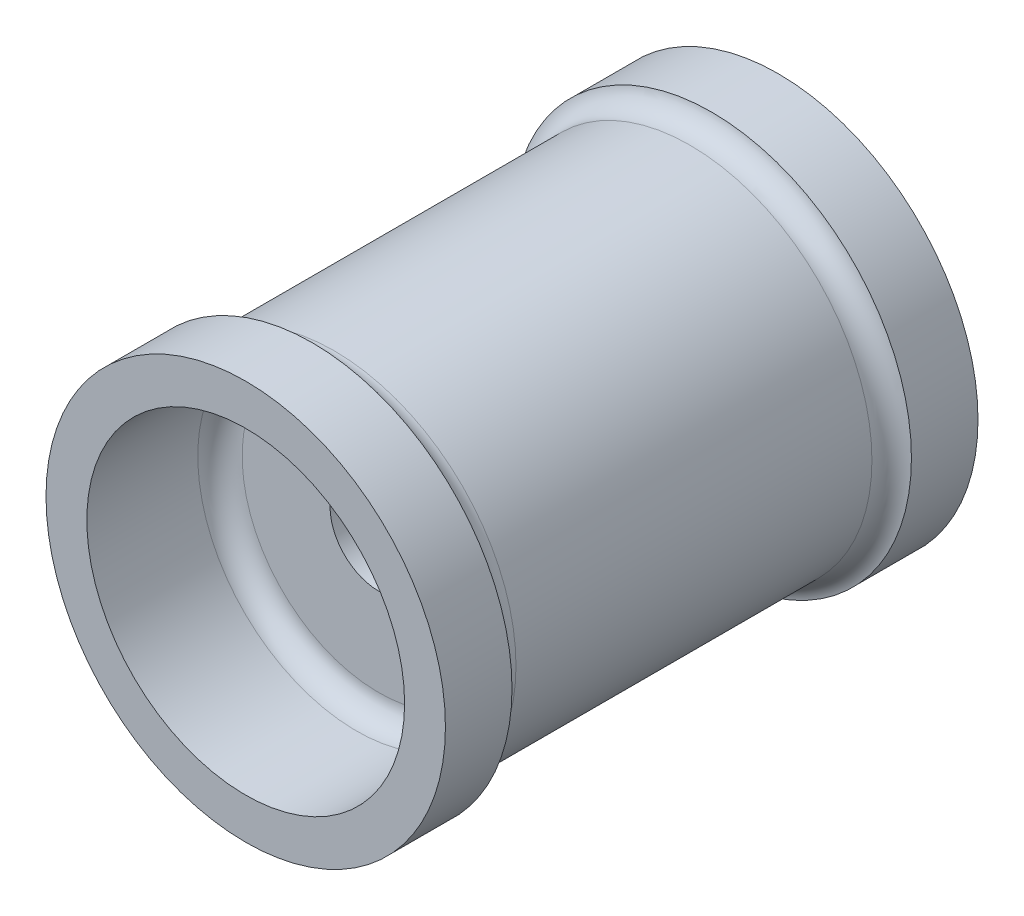
ISO-10303-21;
HEADER;
FILE_DESCRIPTION(('STEP AP214'),'2;1');
FILE_NAME('part.step','',(''),(''),'','','');
FILE_SCHEMA(('AUTOMOTIVE_DESIGN { 1 0 10303 214 1 1 1 1 }'));
ENDSEC;
DATA;
#1=APPLICATION_CONTEXT('core data for automotive mechanical design processes');
#2=APPLICATION_PROTOCOL_DEFINITION('international standard','automotive_design',2000,#1);
#3=PRODUCT_CONTEXT('',#1,'mechanical');
#4=PRODUCT('Part','Part','',(#3));
#5=PRODUCT_RELATED_PRODUCT_CATEGORY('part','',(#4));
#6=PRODUCT_DEFINITION_FORMATION('','',#4);
#7=PRODUCT_DEFINITION_CONTEXT('part definition',#1,'design');
#8=PRODUCT_DEFINITION('design','',#6,#7);
#9=PRODUCT_DEFINITION_SHAPE('','',#8);
#10=(LENGTH_UNIT() NAMED_UNIT(*) SI_UNIT(.MILLI.,.METRE.));
#11=(NAMED_UNIT(*) PLANE_ANGLE_UNIT() SI_UNIT($,.RADIAN.));
#12=(NAMED_UNIT(*) SI_UNIT($,.STERADIAN.) SOLID_ANGLE_UNIT());
#13=UNCERTAINTY_MEASURE_WITH_UNIT(LENGTH_MEASURE(1.E-05),#10,'distance_accuracy_value','');
#14=(GEOMETRIC_REPRESENTATION_CONTEXT(3) GLOBAL_UNCERTAINTY_ASSIGNED_CONTEXT((#13)) GLOBAL_UNIT_ASSIGNED_CONTEXT((#10,
#11,#12)) REPRESENTATION_CONTEXT('',''));
#15=CARTESIAN_POINT('',(0.,0.,0.));
#16=DIRECTION('',(0.,0.,1.));
#17=DIRECTION('',(1.,0.,0.));
#18=AXIS2_PLACEMENT_3D('',#15,#16,#17);
#19=CARTESIAN_POINT('',(0.,0.,16.));
#20=DIRECTION('',(0.,0.,1.));
#21=DIRECTION('',(1.,0.,0.));
#22=AXIS2_PLACEMENT_3D('',#19,#20,#21);
#23=TOROIDAL_SURFACE('',#22,6.16,1.);
#24=CARTESIAN_POINT('',(0.,0.,15.));
#25=DIRECTION('',(0.,0.,1.));
#26=DIRECTION('',(1.,0.,0.));
#27=AXIS2_PLACEMENT_3D('',#24,#25,#26);
#28=CIRCLE('',#27,6.16);
#29=CARTESIAN_POINT('',(6.16,0.,15.));
#30=VERTEX_POINT('',#29);
#31=EDGE_CURVE('E48',#30,#30,#28,.T.);
#32=ORIENTED_EDGE('',*,*,#31,.F.);
#33=EDGE_LOOP('',(#32));
#34=FACE_BOUND('',#33,.T.);
#35=CARTESIAN_POINT('',(0.,0.,16.));
#36=DIRECTION('',(0.,0.,1.));
#37=DIRECTION('',(1.,0.,0.));
#38=AXIS2_PLACEMENT_3D('',#35,#36,#37);
#39=CIRCLE('',#38,7.16);
#40=CARTESIAN_POINT('',(7.16,0.,16.));
#41=VERTEX_POINT('',#40);
#42=EDGE_CURVE('E10',#41,#41,#39,.F.);
#43=ORIENTED_EDGE('',*,*,#42,.F.);
#44=EDGE_LOOP('',(#43));
#45=FACE_BOUND('',#44,.T.);
#46=ADVANCED_FACE('F41',(#34,#45),#23,.F.);
#47=CARTESIAN_POINT('',(0.,0.,2.));
#48=DIRECTION('',(0.,0.,-1.));
#49=DIRECTION('',(-1.,0.,0.));
#50=AXIS2_PLACEMENT_3D('',#47,#48,#49);
#51=TOROIDAL_SURFACE('',#50,6.16,1.);
#52=CARTESIAN_POINT('',(0.,0.,3.));
#53=DIRECTION('',(0.,0.,-1.));
#54=DIRECTION('',(-1.,0.,0.));
#55=AXIS2_PLACEMENT_3D('',#52,#53,#54);
#56=CIRCLE('',#55,6.16);
#57=CARTESIAN_POINT('',(-6.16,0.,3.));
#58=VERTEX_POINT('',#57);
#59=EDGE_CURVE('E58',#58,#58,#56,.T.);
#60=ORIENTED_EDGE('',*,*,#59,.F.);
#61=EDGE_LOOP('',(#60));
#62=FACE_BOUND('',#61,.T.);
#63=CARTESIAN_POINT('',(0.,0.,2.));
#64=DIRECTION('',(0.,0.,-1.));
#65=DIRECTION('',(-1.,0.,0.));
#66=AXIS2_PLACEMENT_3D('',#63,#64,#65);
#67=CIRCLE('',#66,7.16);
#68=CARTESIAN_POINT('',(-7.16,0.,2.));
#69=VERTEX_POINT('',#68);
#70=EDGE_CURVE('E53',#69,#69,#67,.F.);
#71=ORIENTED_EDGE('',*,*,#70,.F.);
#72=EDGE_LOOP('',(#71));
#73=FACE_BOUND('',#72,.T.);
#74=ADVANCED_FACE('F122',(#62,#73),#51,.F.);
#75=CARTESIAN_POINT('',(0.,0.,18.));
#76=DIRECTION('',(0.,0.,-1.));
#77=DIRECTION('',(-1.,0.,0.));
#78=AXIS2_PLACEMENT_3D('',#75,#76,#77);
#79=CYLINDRICAL_SURFACE('',#78,2.2);
#80=CARTESIAN_POINT('',(0.,0.,3.));
#81=DIRECTION('',(0.,0.,-1.));
#82=DIRECTION('',(-1.,0.,0.));
#83=AXIS2_PLACEMENT_3D('',#80,#81,#82);
#84=CIRCLE('',#83,2.2);
#85=CARTESIAN_POINT('',(-2.2,0.,3.));
#86=VERTEX_POINT('',#85);
#87=EDGE_CURVE('E73',#86,#86,#84,.T.);
#88=ORIENTED_EDGE('',*,*,#87,.T.);
#89=EDGE_LOOP('',(#88));
#90=FACE_BOUND('',#89,.T.);
#91=CARTESIAN_POINT('',(0.,0.,15.));
#92=DIRECTION('',(0.,0.,1.));
#93=DIRECTION('',(1.,0.,0.));
#94=AXIS2_PLACEMENT_3D('',#91,#92,#93);
#95=CIRCLE('',#94,2.2);
#96=CARTESIAN_POINT('',(2.2,0.,15.));
#97=VERTEX_POINT('',#96);
#98=EDGE_CURVE('E100',#97,#97,#95,.T.);
#99=ORIENTED_EDGE('',*,*,#98,.T.);
#100=EDGE_LOOP('',(#99));
#101=FACE_BOUND('',#100,.T.);
#102=ADVANCED_FACE('F105',(#90,#101),#79,.F.);
#103=CARTESIAN_POINT('',(0.,0.,18.));
#104=DIRECTION('',(0.,0.,-1.));
#105=DIRECTION('',(-1.,0.,0.));
#106=AXIS2_PLACEMENT_3D('',#103,#104,#105);
#107=CYLINDRICAL_SURFACE('',#106,8.2);
#108=CARTESIAN_POINT('',(0.,0.,0.979795897113271));
#109=DIRECTION('',(0.,0.,-1.));
#110=DIRECTION('',(-1.,0.,0.));
#111=AXIS2_PLACEMENT_3D('',#108,#109,#110);
#112=CIRCLE('',#111,8.2);
#113=CARTESIAN_POINT('',(-8.2,0.,0.979795897113271));
#114=VERTEX_POINT('',#113);
#115=EDGE_CURVE('E64',#114,#114,#112,.F.);
#116=ORIENTED_EDGE('',*,*,#115,.T.);
#117=EDGE_LOOP('',(#116));
#118=FACE_BOUND('',#117,.T.);
#119=CARTESIAN_POINT('',(0.,0.,17.0202041028867));
#120=DIRECTION('',(0.,0.,1.));
#121=DIRECTION('',(1.,0.,0.));
#122=AXIS2_PLACEMENT_3D('',#119,#120,#121);
#123=CIRCLE('',#122,8.2);
#124=CARTESIAN_POINT('',(8.2,0.,17.0202041028867));
#125=VERTEX_POINT('',#124);
#126=EDGE_CURVE('E68',#125,#125,#123,.F.);
#127=ORIENTED_EDGE('',*,*,#126,.T.);
#128=EDGE_LOOP('',(#127));
#129=FACE_BOUND('',#128,.T.);
#130=ADVANCED_FACE('F132',(#118,#129),#107,.T.);
#131=CARTESIAN_POINT('',(0.,0.,21.));
#132=DIRECTION('',(0.,0.,1.));
#133=DIRECTION('',(1.,0.,0.));
#134=AXIS2_PLACEMENT_3D('',#131,#132,#133);
#135=PLANE('',#134);
#136=CARTESIAN_POINT('',(0.,0.,21.));
#137=DIRECTION('',(0.,0.,1.));
#138=DIRECTION('',(1.,0.,0.));
#139=AXIS2_PLACEMENT_3D('',#136,#137,#138);
#140=CIRCLE('',#139,7.16);
#141=CARTESIAN_POINT('',(7.16,0.,21.));
#142=VERTEX_POINT('',#141);
#143=EDGE_CURVE('E96',#142,#142,#140,.T.);
#144=ORIENTED_EDGE('',*,*,#143,.F.);
#145=EDGE_LOOP('',(#144));
#146=FACE_BOUND('',#145,.T.);
#147=CARTESIAN_POINT('',(0.,0.,21.));
#148=DIRECTION('',(0.,0.,1.));
#149=DIRECTION('',(1.,0.,0.));
#150=AXIS2_PLACEMENT_3D('',#147,#148,#149);
#151=CIRCLE('',#150,9.);
#152=CARTESIAN_POINT('',(9.,0.,21.));
#153=VERTEX_POINT('',#152);
#154=EDGE_CURVE('E72',#153,#153,#151,.T.);
#155=ORIENTED_EDGE('',*,*,#154,.T.);
#156=EDGE_LOOP('',(#155));
#157=FACE_BOUND('',#156,.T.);
#158=ADVANCED_FACE('F142',(#146,#157),#135,.T.);
#159=CARTESIAN_POINT('',(0.,0.,21.));
#160=DIRECTION('',(0.,0.,-1.));
#161=DIRECTION('',(-1.,0.,0.));
#162=AXIS2_PLACEMENT_3D('',#159,#160,#161);
#163=CYLINDRICAL_SURFACE('',#162,9.);
#164=ORIENTED_EDGE('',*,*,#154,.F.);
#165=EDGE_LOOP('',(#164));
#166=FACE_BOUND('',#165,.T.);
#167=CARTESIAN_POINT('',(0.,0.,18.));
#168=DIRECTION('',(0.,0.,1.));
#169=DIRECTION('',(1.,0.,0.));
#170=AXIS2_PLACEMENT_3D('',#167,#168,#169);
#171=CIRCLE('',#170,9.);
#172=CARTESIAN_POINT('',(9.,0.,18.));
#173=VERTEX_POINT('',#172);
#174=EDGE_CURVE('E79',#173,#173,#171,.T.);
#175=ORIENTED_EDGE('',*,*,#174,.T.);
#176=EDGE_LOOP('',(#175));
#177=FACE_BOUND('',#176,.T.);
#178=ADVANCED_FACE('F145',(#166,#177),#163,.T.);
#179=CARTESIAN_POINT('',(0.,0.,-3.));
#180=DIRECTION('',(0.,0.,-1.));
#181=DIRECTION('',(-1.,0.,0.));
#182=AXIS2_PLACEMENT_3D('',#179,#180,#181);
#183=PLANE('',#182);
#184=CARTESIAN_POINT('',(0.,0.,-3.));
#185=DIRECTION('',(0.,0.,-1.));
#186=DIRECTION('',(-1.,0.,0.));
#187=AXIS2_PLACEMENT_3D('',#184,#185,#186);
#188=CIRCLE('',#187,7.16);
#189=CARTESIAN_POINT('',(-7.16,0.,-3.));
#190=VERTEX_POINT('',#189);
#191=EDGE_CURVE('E78',#190,#190,#188,.T.);
#192=ORIENTED_EDGE('',*,*,#191,.F.);
#193=EDGE_LOOP('',(#192));
#194=FACE_BOUND('',#193,.T.);
#195=CARTESIAN_POINT('',(0.,0.,-3.));
#196=DIRECTION('',(0.,0.,-1.));
#197=DIRECTION('',(-1.,0.,0.));
#198=AXIS2_PLACEMENT_3D('',#195,#196,#197);
#199=CIRCLE('',#198,9.);
#200=CARTESIAN_POINT('',(-9.,0.,-3.));
#201=VERTEX_POINT('',#200);
#202=EDGE_CURVE('E83',#201,#201,#199,.T.);
#203=ORIENTED_EDGE('',*,*,#202,.T.);
#204=EDGE_LOOP('',(#203));
#205=FACE_BOUND('',#204,.T.);
#206=ADVANCED_FACE('F148',(#194,#205),#183,.T.);
#207=CARTESIAN_POINT('',(0.,0.,-3.));
#208=DIRECTION('',(0.,0.,1.));
#209=DIRECTION('',(1.,0.,0.));
#210=AXIS2_PLACEMENT_3D('',#207,#208,#209);
#211=CYLINDRICAL_SURFACE('',#210,9.);
#212=ORIENTED_EDGE('',*,*,#202,.F.);
#213=EDGE_LOOP('',(#212));
#214=FACE_BOUND('',#213,.T.);
#215=CARTESIAN_POINT('',(0.,0.,0.));
#216=DIRECTION('',(0.,0.,-1.));
#217=DIRECTION('',(-1.,0.,0.));
#218=AXIS2_PLACEMENT_3D('',#215,#216,#217);
#219=CIRCLE('',#218,9.);
#220=CARTESIAN_POINT('',(-9.,0.,0.));
#221=VERTEX_POINT('',#220);
#222=EDGE_CURVE('E77',#221,#221,#219,.T.);
#223=ORIENTED_EDGE('',*,*,#222,.T.);
#224=EDGE_LOOP('',(#223));
#225=FACE_BOUND('',#224,.T.);
#226=ADVANCED_FACE('F153',(#214,#225),#211,.T.);
#227=CARTESIAN_POINT('',(0.,0.,3.));
#228=DIRECTION('',(0.,0.,-1.));
#229=DIRECTION('',(-1.,0.,0.));
#230=AXIS2_PLACEMENT_3D('',#227,#228,#229);
#231=CYLINDRICAL_SURFACE('',#230,7.16);
#232=ORIENTED_EDGE('',*,*,#70,.T.);
#233=EDGE_LOOP('',(#232));
#234=FACE_BOUND('',#233,.T.);
#235=ORIENTED_EDGE('',*,*,#191,.T.);
#236=EDGE_LOOP('',(#235));
#237=FACE_BOUND('',#236,.T.);
#238=ADVANCED_FACE('F156',(#234,#237),#231,.F.);
#239=CARTESIAN_POINT('',(0.,0.,3.));
#240=DIRECTION('',(0.,0.,-1.));
#241=DIRECTION('',(-1.,0.,0.));
#242=AXIS2_PLACEMENT_3D('',#239,#240,#241);
#243=PLANE('',#242);
#244=ORIENTED_EDGE('',*,*,#59,.T.);
#245=EDGE_LOOP('',(#244));
#246=FACE_BOUND('',#245,.T.);
#247=ORIENTED_EDGE('',*,*,#87,.F.);
#248=EDGE_LOOP('',(#247));
#249=FACE_BOUND('',#248,.T.);
#250=ADVANCED_FACE('F119',(#246,#249),#243,.T.);
#251=CARTESIAN_POINT('',(0.,0.,15.));
#252=DIRECTION('',(0.,0.,1.));
#253=DIRECTION('',(1.,0.,0.));
#254=AXIS2_PLACEMENT_3D('',#251,#252,#253);
#255=CYLINDRICAL_SURFACE('',#254,7.16);
#256=ORIENTED_EDGE('',*,*,#42,.T.);
#257=EDGE_LOOP('',(#256));
#258=FACE_BOUND('',#257,.T.);
#259=ORIENTED_EDGE('',*,*,#143,.T.);
#260=EDGE_LOOP('',(#259));
#261=FACE_BOUND('',#260,.T.);
#262=ADVANCED_FACE('F110',(#258,#261),#255,.F.);
#263=CARTESIAN_POINT('',(0.,0.,15.));
#264=DIRECTION('',(0.,0.,1.));
#265=DIRECTION('',(1.,0.,0.));
#266=AXIS2_PLACEMENT_3D('',#263,#264,#265);
#267=PLANE('',#266);
#268=ORIENTED_EDGE('',*,*,#31,.T.);
#269=EDGE_LOOP('',(#268));
#270=FACE_BOUND('',#269,.T.);
#271=ORIENTED_EDGE('',*,*,#98,.F.);
#272=EDGE_LOOP('',(#271));
#273=FACE_BOUND('',#272,.T.);
#274=ADVANCED_FACE('F107',(#270,#273),#267,.T.);
#275=CARTESIAN_POINT('',(0.,0.,0.979795897113271));
#276=DIRECTION('',(0.,0.,-1.));
#277=DIRECTION('',(-1.,0.,0.));
#278=AXIS2_PLACEMENT_3D('',#275,#276,#277);
#279=TOROIDAL_SURFACE('',#278,9.2,1.);
#280=ORIENTED_EDGE('',*,*,#222,.F.);
#281=EDGE_LOOP('',(#280));
#282=FACE_BOUND('',#281,.T.);
#283=ORIENTED_EDGE('',*,*,#115,.F.);
#284=EDGE_LOOP('',(#283));
#285=FACE_BOUND('',#284,.T.);
#286=ADVANCED_FACE('F109',(#282,#285),#279,.F.);
#287=CARTESIAN_POINT('',(0.,0.,17.0202041028867));
#288=DIRECTION('',(0.,0.,1.));
#289=DIRECTION('',(1.,0.,0.));
#290=AXIS2_PLACEMENT_3D('',#287,#288,#289);
#291=TOROIDAL_SURFACE('',#290,9.2,1.);
#292=ORIENTED_EDGE('',*,*,#126,.F.);
#293=EDGE_LOOP('',(#292));
#294=FACE_BOUND('',#293,.T.);
#295=ORIENTED_EDGE('',*,*,#174,.F.);
#296=EDGE_LOOP('',(#295));
#297=FACE_BOUND('',#296,.T.);
#298=ADVANCED_FACE('F116',(#294,#297),#291,.F.);
#299=CLOSED_SHELL('',(#46,#74,#102,#130,#158,#178,#206,#226,#238,#250,#262,#274,#286,#298));
#300=MANIFOLD_SOLID_BREP('B2',#299);
#301=ADVANCED_BREP_SHAPE_REPRESENTATION('',(#18,#300),#14);
#302=SHAPE_DEFINITION_REPRESENTATION(#9,#301);
ENDSEC;
END-ISO-10303-21;
